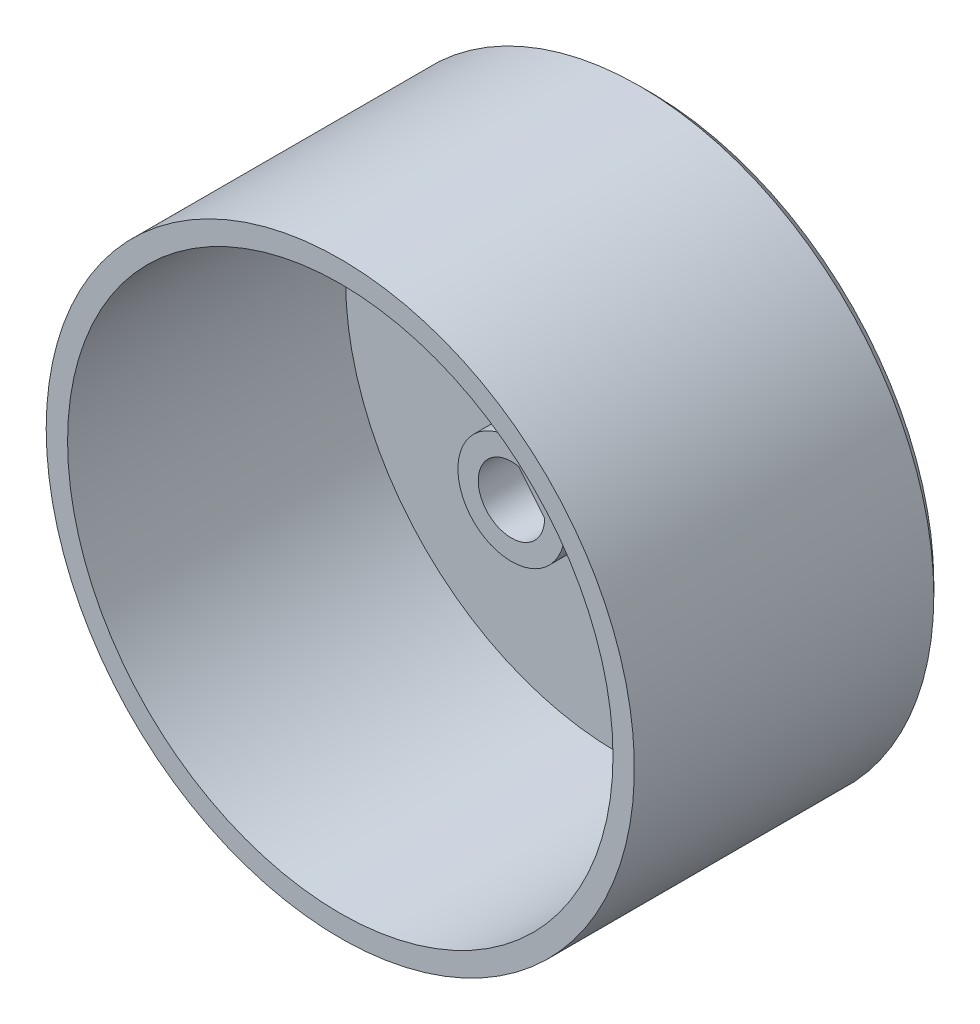
ISO-10303-21;
HEADER;
FILE_DESCRIPTION(('STEP AP214'),'2;1');
FILE_NAME('part.step','',(''),(''),'','','');
FILE_SCHEMA(('AUTOMOTIVE_DESIGN { 1 0 10303 214 1 1 1 1 }'));
ENDSEC;
DATA;
#1=APPLICATION_CONTEXT('core data for automotive mechanical design processes');
#2=APPLICATION_PROTOCOL_DEFINITION('international standard','automotive_design',2000,#1);
#3=PRODUCT_CONTEXT('',#1,'mechanical');
#4=PRODUCT('Part','Part','',(#3));
#5=PRODUCT_RELATED_PRODUCT_CATEGORY('part','',(#4));
#6=PRODUCT_DEFINITION_FORMATION('','',#4);
#7=PRODUCT_DEFINITION_CONTEXT('part definition',#1,'design');
#8=PRODUCT_DEFINITION('design','',#6,#7);
#9=PRODUCT_DEFINITION_SHAPE('','',#8);
#10=(LENGTH_UNIT() NAMED_UNIT(*) SI_UNIT(.MILLI.,.METRE.));
#11=(NAMED_UNIT(*) PLANE_ANGLE_UNIT() SI_UNIT($,.RADIAN.));
#12=(NAMED_UNIT(*) SI_UNIT($,.STERADIAN.) SOLID_ANGLE_UNIT());
#13=UNCERTAINTY_MEASURE_WITH_UNIT(LENGTH_MEASURE(1.E-05),#10,'distance_accuracy_value','');
#14=(GEOMETRIC_REPRESENTATION_CONTEXT(3) GLOBAL_UNCERTAINTY_ASSIGNED_CONTEXT((#13)) GLOBAL_UNIT_ASSIGNED_CONTEXT((#10,
#11,#12)) REPRESENTATION_CONTEXT('',''));
#15=CARTESIAN_POINT('',(0.,0.,0.));
#16=DIRECTION('',(0.,0.,1.));
#17=DIRECTION('',(1.,0.,0.));
#18=AXIS2_PLACEMENT_3D('',#15,#16,#17);
#19=CARTESIAN_POINT('',(0.,0.,3.));
#20=DIRECTION('',(0.,0.,1.));
#21=DIRECTION('',(1.,0.,0.));
#22=AXIS2_PLACEMENT_3D('',#19,#20,#21);
#23=CYLINDRICAL_SURFACE('',#22,5.);
#24=CARTESIAN_POINT('',(0.,0.,3.));
#25=DIRECTION('',(0.,0.,1.));
#26=DIRECTION('',(1.,0.,0.));
#27=AXIS2_PLACEMENT_3D('',#24,#25,#26);
#28=CIRCLE('',#27,5.);
#29=CARTESIAN_POINT('',(5.,0.,3.));
#30=VERTEX_POINT('',#29);
#31=EDGE_CURVE('E91',#30,#30,#28,.T.);
#32=CARTESIAN_POINT('',(0.,0.,13.));
#33=DIRECTION('',(0.,0.,1.));
#34=DIRECTION('',(1.,0.,0.));
#35=AXIS2_PLACEMENT_3D('',#32,#33,#34);
#36=CIRCLE('',#35,5.);
#37=CARTESIAN_POINT('',(5.,0.,13.));
#38=VERTEX_POINT('',#37);
#39=EDGE_CURVE('E82',#38,#38,#36,.F.);
#40=CARTESIAN_POINT('',(5.,0.,3.));
#41=CARTESIAN_POINT('',(5.,0.,3.10416666666667));
#42=CARTESIAN_POINT('',(5.,0.,3.20833333333334));
#43=CARTESIAN_POINT('',(5.,0.,3.41666666666667));
#44=CARTESIAN_POINT('',(5.,0.,3.52083333333334));
#45=CARTESIAN_POINT('',(5.,0.,3.72916666666667));
#46=CARTESIAN_POINT('',(5.,0.,3.83333333333334));
#47=CARTESIAN_POINT('',(5.,0.,4.04166666666667));
#48=CARTESIAN_POINT('',(5.,0.,4.14583333333334));
#49=CARTESIAN_POINT('',(5.,0.,4.35416666666667));
#50=CARTESIAN_POINT('',(5.,0.,4.45833333333334));
#51=CARTESIAN_POINT('',(5.,0.,4.66666666666667));
#52=CARTESIAN_POINT('',(5.,0.,4.77083333333334));
#53=CARTESIAN_POINT('',(5.,0.,4.97916666666667));
#54=CARTESIAN_POINT('',(5.,0.,5.08333333333333));
#55=CARTESIAN_POINT('',(5.,0.,5.29166666666667));
#56=CARTESIAN_POINT('',(5.,0.,5.39583333333333));
#57=CARTESIAN_POINT('',(5.,0.,5.60416666666667));
#58=CARTESIAN_POINT('',(5.,0.,5.70833333333333));
#59=CARTESIAN_POINT('',(5.,0.,5.91666666666667));
#60=CARTESIAN_POINT('',(5.,0.,6.02083333333333));
#61=CARTESIAN_POINT('',(5.,0.,6.22916666666667));
#62=CARTESIAN_POINT('',(5.,0.,6.33333333333333));
#63=CARTESIAN_POINT('',(5.,0.,6.54166666666667));
#64=CARTESIAN_POINT('',(5.,0.,6.64583333333333));
#65=CARTESIAN_POINT('',(5.,0.,6.85416666666667));
#66=CARTESIAN_POINT('',(5.,0.,6.95833333333333));
#67=CARTESIAN_POINT('',(5.,0.,7.16666666666667));
#68=CARTESIAN_POINT('',(5.,0.,7.27083333333333));
#69=CARTESIAN_POINT('',(5.,0.,7.47916666666667));
#70=CARTESIAN_POINT('',(5.,0.,7.58333333333333));
#71=CARTESIAN_POINT('',(5.,0.,7.79166666666667));
#72=CARTESIAN_POINT('',(5.,0.,7.89583333333333));
#73=CARTESIAN_POINT('',(5.,0.,8.10416666666667));
#74=CARTESIAN_POINT('',(5.,0.,8.20833333333333));
#75=CARTESIAN_POINT('',(5.,0.,8.41666666666667));
#76=CARTESIAN_POINT('',(5.,0.,8.52083333333333));
#77=CARTESIAN_POINT('',(5.,0.,8.72916666666667));
#78=CARTESIAN_POINT('',(5.,0.,8.83333333333333));
#79=CARTESIAN_POINT('',(5.,0.,9.04166666666667));
#80=CARTESIAN_POINT('',(5.,0.,9.14583333333333));
#81=CARTESIAN_POINT('',(5.,0.,9.35416666666667));
#82=CARTESIAN_POINT('',(5.,0.,9.45833333333333));
#83=CARTESIAN_POINT('',(5.,0.,9.66666666666667));
#84=CARTESIAN_POINT('',(5.,0.,9.77083333333333));
#85=CARTESIAN_POINT('',(5.,0.,9.97916666666667));
#86=CARTESIAN_POINT('',(5.,0.,10.0833333333333));
#87=CARTESIAN_POINT('',(5.,0.,10.2916666666667));
#88=CARTESIAN_POINT('',(5.,0.,10.3958333333333));
#89=CARTESIAN_POINT('',(5.,0.,10.6041666666667));
#90=CARTESIAN_POINT('',(5.,0.,10.7083333333333));
#91=CARTESIAN_POINT('',(5.,0.,10.9166666666667));
#92=CARTESIAN_POINT('',(5.,0.,11.0208333333333));
#93=CARTESIAN_POINT('',(5.,0.,11.2291666666667));
#94=CARTESIAN_POINT('',(5.,0.,11.3333333333333));
#95=CARTESIAN_POINT('',(5.,0.,11.5416666666667));
#96=CARTESIAN_POINT('',(5.,0.,11.6458333333333));
#97=CARTESIAN_POINT('',(5.,0.,11.8541666666667));
#98=CARTESIAN_POINT('',(5.,0.,11.9583333333333));
#99=CARTESIAN_POINT('',(5.,0.,12.1666666666667));
#100=CARTESIAN_POINT('',(5.,0.,12.2708333333333));
#101=CARTESIAN_POINT('',(5.,0.,12.4791666666667));
#102=CARTESIAN_POINT('',(5.,0.,12.5833333333333));
#103=CARTESIAN_POINT('',(5.,0.,12.7916666666667));
#104=CARTESIAN_POINT('',(5.,0.,12.8958333333333));
#105=CARTESIAN_POINT('',(5.,0.,13.));
#106=B_SPLINE_CURVE_WITH_KNOTS('',3,(#40,#41,#42,#43,#44,#45,#46,#47,#48,#49,#50,#51,#52,#53,
#54,#55,#56,#57,#58,#59,#60,#61,#62,#63,#64,#65,#66,#67,#68,#69,#70,#71,#72,#73,#74,#75,#76,#77,
#78,#79,#80,#81,#82,#83,#84,#85,#86,#87,#88,#89,#90,#91,#92,#93,#94,#95,#96,#97,#98,#99,#100,
#101,#102,#103,#104,#105),.UNSPECIFIED.,.F.,.F.,(4,2,2,2,2,2,2,2,2,2,2,2,2,2,2,2,2,2,2,2,2,2,2,
2,2,2,2,2,2,2,2,2,4),(0.,0.3125,0.625,0.9375,1.25,1.5625,1.875,2.1875,2.5,2.8125,3.125,3.4375,
3.75,4.0625,4.375,4.6875,5.,5.3125,5.625,5.9375,6.25,6.5625,6.875,7.1875,7.5,7.8125,8.125,
8.4375,8.75,9.0625,9.375,9.6875,10.),.UNSPECIFIED.);
#107=EDGE_CURVE('BSEAM43',#30,#38,#106,.T.);
#108=ORIENTED_EDGE('',*,*,#31,.T.);
#109=ORIENTED_EDGE('',*,*,#39,.T.);
#110=ORIENTED_EDGE('',*,*,#107,.T.);
#111=ORIENTED_EDGE('',*,*,#107,.F.);
#112=EDGE_LOOP('',(#108,#110,#109,#111));
#113=FACE_BOUND('',#112,.T.);
#114=ADVANCED_FACE('F43',(#113),#23,.T.);
#115=CARTESIAN_POINT('',(0.,0.,29.));
#116=DIRECTION('',(0.,0.,-1.));
#117=DIRECTION('',(-1.,0.,0.));
#118=AXIS2_PLACEMENT_3D('',#115,#116,#117);
#119=CYLINDRICAL_SURFACE('',#118,27.5);
#120=CARTESIAN_POINT('',(0.,0.,1.00000000000006));
#121=DIRECTION('',(0.,0.,1.));
#122=DIRECTION('',(1.,0.,0.));
#123=AXIS2_PLACEMENT_3D('',#120,#121,#122);
#124=CIRCLE('',#123,27.5);
#125=CARTESIAN_POINT('',(-27.5,0.,1.00000000000006));
#126=VERTEX_POINT('',#125);
#127=EDGE_CURVE('E52',#126,#126,#124,.T.);
#128=CARTESIAN_POINT('',(0.,0.,29.));
#129=DIRECTION('',(0.,0.,1.));
#130=DIRECTION('',(1.,0.,0.));
#131=AXIS2_PLACEMENT_3D('',#128,#129,#130);
#132=CIRCLE('',#131,27.5);
#133=CARTESIAN_POINT('',(-27.5,0.,29.));
#134=VERTEX_POINT('',#133);
#135=EDGE_CURVE('E75',#134,#134,#132,.T.);
#136=CARTESIAN_POINT('',(-27.5,0.,1.00000000000006));
#137=CARTESIAN_POINT('',(-27.5,0.,1.29166666666672));
#138=CARTESIAN_POINT('',(-27.5,0.,1.58333333333339));
#139=CARTESIAN_POINT('',(-27.5,0.,2.16666666666672));
#140=CARTESIAN_POINT('',(-27.5,0.,2.45833333333339));
#141=CARTESIAN_POINT('',(-27.5,0.,3.04166666666672));
#142=CARTESIAN_POINT('',(-27.5,0.,3.33333333333339));
#143=CARTESIAN_POINT('',(-27.5,0.,3.91666666666672));
#144=CARTESIAN_POINT('',(-27.5,0.,4.20833333333338));
#145=CARTESIAN_POINT('',(-27.5,0.,4.79166666666671));
#146=CARTESIAN_POINT('',(-27.5,0.,5.08333333333338));
#147=CARTESIAN_POINT('',(-27.5,0.,5.66666666666671));
#148=CARTESIAN_POINT('',(-27.5,0.,5.95833333333338));
#149=CARTESIAN_POINT('',(-27.5,0.,6.54166666666671));
#150=CARTESIAN_POINT('',(-27.5,0.,6.83333333333338));
#151=CARTESIAN_POINT('',(-27.5,0.,7.41666666666671));
#152=CARTESIAN_POINT('',(-27.5,0.,7.70833333333338));
#153=CARTESIAN_POINT('',(-27.5,0.,8.29166666666671));
#154=CARTESIAN_POINT('',(-27.5,0.,8.58333333333337));
#155=CARTESIAN_POINT('',(-27.5,0.,9.16666666666671));
#156=CARTESIAN_POINT('',(-27.5,0.,9.45833333333337));
#157=CARTESIAN_POINT('',(-27.5,0.,10.0416666666667));
#158=CARTESIAN_POINT('',(-27.5,0.,10.3333333333334));
#159=CARTESIAN_POINT('',(-27.5,0.,10.9166666666667));
#160=CARTESIAN_POINT('',(-27.5,0.,11.2083333333334));
#161=CARTESIAN_POINT('',(-27.5,0.,11.7916666666667));
#162=CARTESIAN_POINT('',(-27.5,0.,12.0833333333334));
#163=CARTESIAN_POINT('',(-27.5,0.,12.6666666666667));
#164=CARTESIAN_POINT('',(-27.5,0.,12.9583333333334));
#165=CARTESIAN_POINT('',(-27.5,0.,13.5416666666667));
#166=CARTESIAN_POINT('',(-27.5,0.,13.8333333333334));
#167=CARTESIAN_POINT('',(-27.5,0.,14.4166666666667));
#168=CARTESIAN_POINT('',(-27.5,0.,14.7083333333334));
#169=CARTESIAN_POINT('',(-27.5,0.,15.2916666666667));
#170=CARTESIAN_POINT('',(-27.5,0.,15.5833333333334));
#171=CARTESIAN_POINT('',(-27.5,0.,16.1666666666667));
#172=CARTESIAN_POINT('',(-27.5,0.,16.4583333333334));
#173=CARTESIAN_POINT('',(-27.5,0.,17.0416666666667));
#174=CARTESIAN_POINT('',(-27.5,0.,17.3333333333334));
#175=CARTESIAN_POINT('',(-27.5,0.,17.9166666666667));
#176=CARTESIAN_POINT('',(-27.5,0.,18.2083333333334));
#177=CARTESIAN_POINT('',(-27.5,0.,18.7916666666667));
#178=CARTESIAN_POINT('',(-27.5,0.,19.0833333333333));
#179=CARTESIAN_POINT('',(-27.5,0.,19.6666666666667));
#180=CARTESIAN_POINT('',(-27.5,0.,19.9583333333334));
#181=CARTESIAN_POINT('',(-27.5,0.,20.5416666666667));
#182=CARTESIAN_POINT('',(-27.5,0.,20.8333333333333));
#183=CARTESIAN_POINT('',(-27.5,0.,21.4166666666667));
#184=CARTESIAN_POINT('',(-27.5,0.,21.7083333333333));
#185=CARTESIAN_POINT('',(-27.5,0.,22.2916666666667));
#186=CARTESIAN_POINT('',(-27.5,0.,22.5833333333333));
#187=CARTESIAN_POINT('',(-27.5,0.,23.1666666666667));
#188=CARTESIAN_POINT('',(-27.5,0.,23.4583333333333));
#189=CARTESIAN_POINT('',(-27.5,0.,24.0416666666667));
#190=CARTESIAN_POINT('',(-27.5,0.,24.3333333333333));
#191=CARTESIAN_POINT('',(-27.5,0.,24.9166666666667));
#192=CARTESIAN_POINT('',(-27.5,0.,25.2083333333333));
#193=CARTESIAN_POINT('',(-27.5,0.,25.7916666666667));
#194=CARTESIAN_POINT('',(-27.5,0.,26.0833333333333));
#195=CARTESIAN_POINT('',(-27.5,0.,26.6666666666667));
#196=CARTESIAN_POINT('',(-27.5,0.,26.9583333333333));
#197=CARTESIAN_POINT('',(-27.5,0.,27.5416666666667));
#198=CARTESIAN_POINT('',(-27.5,0.,27.8333333333333));
#199=CARTESIAN_POINT('',(-27.5,0.,28.4166666666667));
#200=CARTESIAN_POINT('',(-27.5,0.,28.7083333333333));
#201=CARTESIAN_POINT('',(-27.5,0.,29.));
#202=B_SPLINE_CURVE_WITH_KNOTS('',3,(#136,#137,#138,#139,#140,#141,#142,#143,#144,#145,#146,
#147,#148,#149,#150,#151,#152,#153,#154,#155,#156,#157,#158,#159,#160,#161,#162,#163,#164,#165,
#166,#167,#168,#169,#170,#171,#172,#173,#174,#175,#176,#177,#178,#179,#180,#181,#182,#183,#184,
#185,#186,#187,#188,#189,#190,#191,#192,#193,#194,#195,#196,#197,#198,#199,#200,#201),
.UNSPECIFIED.,.F.,.F.,(4,2,2,2,2,2,2,2,2,2,2,2,2,2,2,2,2,2,2,2,2,2,2,2,2,2,2,2,2,2,2,2,4),(0.,
0.874999999999997,1.75,2.625,3.49999999999999,4.37499999999999,5.24999999999999,
6.12499999999999,6.99999999999999,7.87499999999999,8.74999999999998,9.62499999999998,10.5,
11.375,12.25,13.125,14.,14.875,15.75,16.625,17.5,18.375,19.25,20.125,21.,21.875,22.75,23.625,
24.5,25.3749999999999,26.2499999999999,27.1249999999999,27.9999999999999),.UNSPECIFIED.);
#203=EDGE_CURVE('BSEAM104',#126,#134,#202,.T.);
#204=ORIENTED_EDGE('',*,*,#127,.T.);
#205=ORIENTED_EDGE('',*,*,#135,.F.);
#206=ORIENTED_EDGE('',*,*,#203,.T.);
#207=ORIENTED_EDGE('',*,*,#203,.F.);
#208=EDGE_LOOP('',(#204,#206,#205,#207));
#209=FACE_BOUND('',#208,.T.);
#210=ADVANCED_FACE('F104',(#209),#119,.T.);
#211=CARTESIAN_POINT('',(0.,0.,29.));
#212=DIRECTION('',(0.,0.,1.));
#213=DIRECTION('',(1.,0.,0.));
#214=AXIS2_PLACEMENT_3D('',#211,#212,#213);
#215=PLANE('',#214);
#216=CARTESIAN_POINT('',(0.,0.,29.));
#217=DIRECTION('',(0.,0.,1.));
#218=DIRECTION('',(1.,0.,0.));
#219=AXIS2_PLACEMENT_3D('',#216,#217,#218);
#220=CIRCLE('',#219,25.5);
#221=CARTESIAN_POINT('',(25.5,0.,29.));
#222=VERTEX_POINT('',#221);
#223=EDGE_CURVE('E94',#222,#222,#220,.T.);
#224=ORIENTED_EDGE('',*,*,#223,.F.);
#225=EDGE_LOOP('',(#224));
#226=FACE_BOUND('',#225,.T.);
#227=ORIENTED_EDGE('',*,*,#135,.T.);
#228=EDGE_LOOP('',(#227));
#229=FACE_BOUND('',#228,.T.);
#230=ADVANCED_FACE('F120',(#226,#229),#215,.T.);
#231=CARTESIAN_POINT('',(0.,0.,0.));
#232=DIRECTION('',(0.,0.,1.));
#233=DIRECTION('',(1.,0.,0.));
#234=AXIS2_PLACEMENT_3D('',#231,#232,#233);
#235=PLANE('',#234);
#236=CARTESIAN_POINT('',(0.,0.,0.));
#237=DIRECTION('',(0.,0.,1.));
#238=DIRECTION('',(1.,0.,0.));
#239=AXIS2_PLACEMENT_3D('',#236,#237,#238);
#240=CIRCLE('',#239,26.4999999999999);
#241=CARTESIAN_POINT('',(26.4999999999999,0.,0.));
#242=VERTEX_POINT('',#241);
#243=EDGE_CURVE('E13',#242,#242,#240,.F.);
#244=ORIENTED_EDGE('',*,*,#243,.T.);
#245=EDGE_LOOP('',(#244));
#246=FACE_BOUND('',#245,.T.);
#247=ADVANCED_FACE('F131',(#246),#235,.F.);
#248=CARTESIAN_POINT('',(0.,0.,3.));
#249=DIRECTION('',(0.,0.,1.));
#250=DIRECTION('',(1.,0.,0.));
#251=AXIS2_PLACEMENT_3D('',#248,#249,#250);
#252=CYLINDRICAL_SURFACE('',#251,25.5);
#253=CARTESIAN_POINT('',(0.,0.,3.));
#254=DIRECTION('',(0.,0.,1.));
#255=DIRECTION('',(1.,0.,0.));
#256=AXIS2_PLACEMENT_3D('',#253,#254,#255);
#257=CIRCLE('',#256,25.5);
#258=CARTESIAN_POINT('',(25.5,0.,3.));
#259=VERTEX_POINT('',#258);
#260=EDGE_CURVE('E95',#259,#259,#257,.T.);
#261=CARTESIAN_POINT('',(25.5,0.,3.));
#262=CARTESIAN_POINT('',(25.5,0.,3.27083333333334));
#263=CARTESIAN_POINT('',(25.5,0.,3.54166666666667));
#264=CARTESIAN_POINT('',(25.5,0.,4.08333333333334));
#265=CARTESIAN_POINT('',(25.5,0.,4.35416666666667));
#266=CARTESIAN_POINT('',(25.5,0.,4.89583333333334));
#267=CARTESIAN_POINT('',(25.5,0.,5.16666666666667));
#268=CARTESIAN_POINT('',(25.5,0.,5.70833333333333));
#269=CARTESIAN_POINT('',(25.5,0.,5.97916666666667));
#270=CARTESIAN_POINT('',(25.5,0.,6.52083333333333));
#271=CARTESIAN_POINT('',(25.5,0.,6.79166666666667));
#272=CARTESIAN_POINT('',(25.5,0.,7.33333333333334));
#273=CARTESIAN_POINT('',(25.5,0.,7.60416666666667));
#274=CARTESIAN_POINT('',(25.5,0.,8.14583333333334));
#275=CARTESIAN_POINT('',(25.5,0.,8.41666666666667));
#276=CARTESIAN_POINT('',(25.5,0.,8.95833333333334));
#277=CARTESIAN_POINT('',(25.5,0.,9.22916666666667));
#278=CARTESIAN_POINT('',(25.5,0.,9.77083333333333));
#279=CARTESIAN_POINT('',(25.5,0.,10.0416666666667));
#280=CARTESIAN_POINT('',(25.5,0.,10.5833333333333));
#281=CARTESIAN_POINT('',(25.5,0.,10.8541666666667));
#282=CARTESIAN_POINT('',(25.5,0.,11.3958333333333));
#283=CARTESIAN_POINT('',(25.5,0.,11.6666666666667));
#284=CARTESIAN_POINT('',(25.5,0.,12.2083333333333));
#285=CARTESIAN_POINT('',(25.5,0.,12.4791666666667));
#286=CARTESIAN_POINT('',(25.5,0.,13.0208333333333));
#287=CARTESIAN_POINT('',(25.5,0.,13.2916666666667));
#288=CARTESIAN_POINT('',(25.5,0.,13.8333333333333));
#289=CARTESIAN_POINT('',(25.5,0.,14.1041666666667));
#290=CARTESIAN_POINT('',(25.5,0.,14.6458333333333));
#291=CARTESIAN_POINT('',(25.5,0.,14.9166666666667));
#292=CARTESIAN_POINT('',(25.5,0.,15.4583333333333));
#293=CARTESIAN_POINT('',(25.5,0.,15.7291666666667));
#294=CARTESIAN_POINT('',(25.5,0.,16.2708333333333));
#295=CARTESIAN_POINT('',(25.5,0.,16.5416666666667));
#296=CARTESIAN_POINT('',(25.5,0.,17.0833333333333));
#297=CARTESIAN_POINT('',(25.5,0.,17.3541666666667));
#298=CARTESIAN_POINT('',(25.5,0.,17.8958333333333));
#299=CARTESIAN_POINT('',(25.5,0.,18.1666666666667));
#300=CARTESIAN_POINT('',(25.5,0.,18.7083333333333));
#301=CARTESIAN_POINT('',(25.5,0.,18.9791666666667));
#302=CARTESIAN_POINT('',(25.5,0.,19.5208333333333));
#303=CARTESIAN_POINT('',(25.5,0.,19.7916666666667));
#304=CARTESIAN_POINT('',(25.5,0.,20.3333333333333));
#305=CARTESIAN_POINT('',(25.5,0.,20.6041666666667));
#306=CARTESIAN_POINT('',(25.5,0.,21.1458333333333));
#307=CARTESIAN_POINT('',(25.5,0.,21.4166666666667));
#308=CARTESIAN_POINT('',(25.5,0.,21.9583333333333));
#309=CARTESIAN_POINT('',(25.5,0.,22.2291666666667));
#310=CARTESIAN_POINT('',(25.5,0.,22.7708333333333));
#311=CARTESIAN_POINT('',(25.5,0.,23.0416666666667));
#312=CARTESIAN_POINT('',(25.5,0.,23.5833333333333));
#313=CARTESIAN_POINT('',(25.5,0.,23.8541666666667));
#314=CARTESIAN_POINT('',(25.5,0.,24.3958333333333));
#315=CARTESIAN_POINT('',(25.5,0.,24.6666666666667));
#316=CARTESIAN_POINT('',(25.5,0.,25.2083333333333));
#317=CARTESIAN_POINT('',(25.5,0.,25.4791666666667));
#318=CARTESIAN_POINT('',(25.5,0.,26.0208333333333));
#319=CARTESIAN_POINT('',(25.5,0.,26.2916666666667));
#320=CARTESIAN_POINT('',(25.5,0.,26.8333333333333));
#321=CARTESIAN_POINT('',(25.5,0.,27.1041666666667));
#322=CARTESIAN_POINT('',(25.5,0.,27.6458333333333));
#323=CARTESIAN_POINT('',(25.5,0.,27.9166666666667));
#324=CARTESIAN_POINT('',(25.5,0.,28.4583333333333));
#325=CARTESIAN_POINT('',(25.5,0.,28.7291666666667));
#326=CARTESIAN_POINT('',(25.5,0.,29.));
#327=B_SPLINE_CURVE_WITH_KNOTS('',3,(#261,#262,#263,#264,#265,#266,#267,#268,#269,#270,#271,
#272,#273,#274,#275,#276,#277,#278,#279,#280,#281,#282,#283,#284,#285,#286,#287,#288,#289,#290,
#291,#292,#293,#294,#295,#296,#297,#298,#299,#300,#301,#302,#303,#304,#305,#306,#307,#308,#309,
#310,#311,#312,#313,#314,#315,#316,#317,#318,#319,#320,#321,#322,#323,#324,#325,#326),
.UNSPECIFIED.,.F.,.F.,(4,2,2,2,2,2,2,2,2,2,2,2,2,2,2,2,2,2,2,2,2,2,2,2,2,2,2,2,2,2,2,2,4),(0.,
0.8125,1.625,2.4375,3.25,4.0625,4.875,5.6875,6.5,7.3125,8.125,8.9375,9.75,10.5625,11.375,
12.1875,13.,13.8125,14.625,15.4375,16.25,17.0625,17.875,18.6875,19.5,20.3125,21.125,21.9375,
22.75,23.5625,24.375,25.1875,26.),.UNSPECIFIED.);
#328=EDGE_CURVE('BSEAM127',#259,#222,#327,.T.);
#329=ORIENTED_EDGE('',*,*,#260,.F.);
#330=ORIENTED_EDGE('',*,*,#223,.T.);
#331=ORIENTED_EDGE('',*,*,#328,.T.);
#332=ORIENTED_EDGE('',*,*,#328,.F.);
#333=EDGE_LOOP('',(#329,#331,#330,#332));
#334=FACE_BOUND('',#333,.T.);
#335=ADVANCED_FACE('F127',(#334),#252,.F.);
#336=CARTESIAN_POINT('',(0.,0.,3.));
#337=DIRECTION('',(0.,0.,1.));
#338=DIRECTION('',(1.,0.,0.));
#339=AXIS2_PLACEMENT_3D('',#336,#337,#338);
#340=PLANE('',#339);
#341=ORIENTED_EDGE('',*,*,#31,.F.);
#342=EDGE_LOOP('',(#341));
#343=FACE_BOUND('',#342,.T.);
#344=ORIENTED_EDGE('',*,*,#260,.T.);
#345=EDGE_LOOP('',(#344));
#346=FACE_BOUND('',#345,.T.);
#347=ADVANCED_FACE('F124',(#343,#346),#340,.T.);
#348=CARTESIAN_POINT('',(0.,0.,13.));
#349=DIRECTION('',(0.,0.,1.));
#350=DIRECTION('',(1.,0.,0.));
#351=AXIS2_PLACEMENT_3D('',#348,#349,#350);
#352=PLANE('',#351);
#353=ORIENTED_EDGE('',*,*,#39,.F.);
#354=EDGE_LOOP('',(#353));
#355=FACE_BOUND('',#354,.T.);
#356=CARTESIAN_POINT('',(0.,0.,13.));
#357=DIRECTION('',(0.,0.,1.));
#358=DIRECTION('',(1.,0.,0.));
#359=AXIS2_PLACEMENT_3D('',#356,#357,#358);
#360=CIRCLE('',#359,3.1);
#361=CARTESIAN_POINT('',(3.09933228784824,0.0643379320571023,13.));
#362=VERTEX_POINT('',#361);
#363=CARTESIAN_POINT('',(0.710106360358082,3.01757335569146,13.));
#364=VERTEX_POINT('',#363);
#365=EDGE_CURVE('E58',#362,#364,#360,.F.);
#366=ORIENTED_EDGE('',*,*,#365,.T.);
#367=DIRECTION('',(0.628961487295624,-0.777436458817617,0.));
#368=VECTOR('',#367,1.);
#369=CARTESIAN_POINT('',(0.710106360358082,3.01757335569146,13.));
#370=LINE('',#369,#368);
#371=EDGE_CURVE('E72',#364,#362,#370,.T.);
#372=ORIENTED_EDGE('',*,*,#371,.T.);
#373=EDGE_LOOP('',(#366,#372));
#374=FACE_BOUND('',#373,.T.);
#375=ADVANCED_FACE('F73',(#355,#374),#352,.T.);
#376=CARTESIAN_POINT('',(0.,0.,3.));
#377=DIRECTION('',(0.,0.,1.));
#378=DIRECTION('',(1.,0.,0.));
#379=AXIS2_PLACEMENT_3D('',#376,#377,#378);
#380=PLANE('',#379);
#381=CARTESIAN_POINT('',(0.,0.,3.));
#382=DIRECTION('',(0.,0.,1.));
#383=DIRECTION('',(1.,0.,0.));
#384=AXIS2_PLACEMENT_3D('',#381,#382,#383);
#385=CIRCLE('',#384,3.1);
#386=CARTESIAN_POINT('',(3.09933228784824,0.0643379320571023,3.));
#387=VERTEX_POINT('',#386);
#388=CARTESIAN_POINT('',(0.710106360358082,3.01757335569146,3.));
#389=VERTEX_POINT('',#388);
#390=EDGE_CURVE('E86',#387,#389,#385,.F.);
#391=ORIENTED_EDGE('',*,*,#390,.F.);
#392=DIRECTION('',(0.628961487295624,-0.777436458817617,0.));
#393=VECTOR('',#392,1.);
#394=CARTESIAN_POINT('',(0.710106360358082,3.01757335569146,3.));
#395=LINE('',#394,#393);
#396=EDGE_CURVE('E66',#389,#387,#395,.T.);
#397=ORIENTED_EDGE('',*,*,#396,.F.);
#398=EDGE_LOOP('',(#391,#397));
#399=FACE_BOUND('',#398,.T.);
#400=ADVANCED_FACE('F158',(#399),#380,.T.);
#401=CARTESIAN_POINT('',(0.710106360358082,3.01757335569146,-5.76812408671319));
#402=DIRECTION('',(0.777436458817617,0.628961487295624,0.));
#403=DIRECTION('',(-0.628961487295624,0.777436458817617,0.));
#404=AXIS2_PLACEMENT_3D('',#401,#402,#403);
#405=PLANE('',#404);
#406=ORIENTED_EDGE('',*,*,#371,.F.);
#407=DIRECTION('',(0.,0.,1.));
#408=VECTOR('',#407,1.);
#409=CARTESIAN_POINT('',(0.710106360358082,3.01757335569146,-5.76812408671319));
#410=LINE('',#409,#408);
#411=EDGE_CURVE('E81',#389,#364,#410,.T.);
#412=ORIENTED_EDGE('',*,*,#411,.F.);
#413=ORIENTED_EDGE('',*,*,#396,.T.);
#414=DIRECTION('',(0.,0.,1.));
#415=VECTOR('',#414,1.);
#416=CARTESIAN_POINT('',(3.09933228784824,0.0643379320571023,-5.76812408671319));
#417=LINE('',#416,#415);
#418=EDGE_CURVE('E80',#387,#362,#417,.T.);
#419=ORIENTED_EDGE('',*,*,#418,.T.);
#420=EDGE_LOOP('',(#406,#412,#413,#419));
#421=FACE_BOUND('',#420,.T.);
#422=ADVANCED_FACE('F84',(#421),#405,.F.);
#423=CARTESIAN_POINT('',(0.,0.,-5.76812408671319));
#424=DIRECTION('',(0.,0.,1.));
#425=DIRECTION('',(1.,0.,0.));
#426=AXIS2_PLACEMENT_3D('',#423,#424,#425);
#427=CYLINDRICAL_SURFACE('',#426,3.1);
#428=ORIENTED_EDGE('',*,*,#365,.F.);
#429=ORIENTED_EDGE('',*,*,#418,.F.);
#430=ORIENTED_EDGE('',*,*,#390,.T.);
#431=ORIENTED_EDGE('',*,*,#411,.T.);
#432=EDGE_LOOP('',(#428,#429,#430,#431));
#433=FACE_BOUND('',#432,.T.);
#434=ADVANCED_FACE('F79',(#433),#427,.F.);
#435=CARTESIAN_POINT('',(0.,0.,1.00000000000006));
#436=DIRECTION('',(0.,0.,1.));
#437=DIRECTION('',(1.,0.,0.));
#438=AXIS2_PLACEMENT_3D('',#435,#436,#437);
#439=CONICAL_SURFACE('',#438,27.5,0.785398163397448);
#440=ORIENTED_EDGE('',*,*,#243,.F.);
#441=EDGE_LOOP('',(#440));
#442=FACE_BOUND('',#441,.T.);
#443=ORIENTED_EDGE('',*,*,#127,.F.);
#444=EDGE_LOOP('',(#443));
#445=FACE_BOUND('',#444,.T.);
#446=ADVANCED_FACE('F46',(#442,#445),#439,.T.);
#447=CLOSED_SHELL('',(#114,#210,#230,#247,#335,#347,#375,#400,#422,#434,#446));
#448=MANIFOLD_SOLID_BREP('B2',#447);
#449=ADVANCED_BREP_SHAPE_REPRESENTATION('',(#18,#448),#14);
#450=SHAPE_DEFINITION_REPRESENTATION(#9,#449);
ENDSEC;
END-ISO-10303-21;
